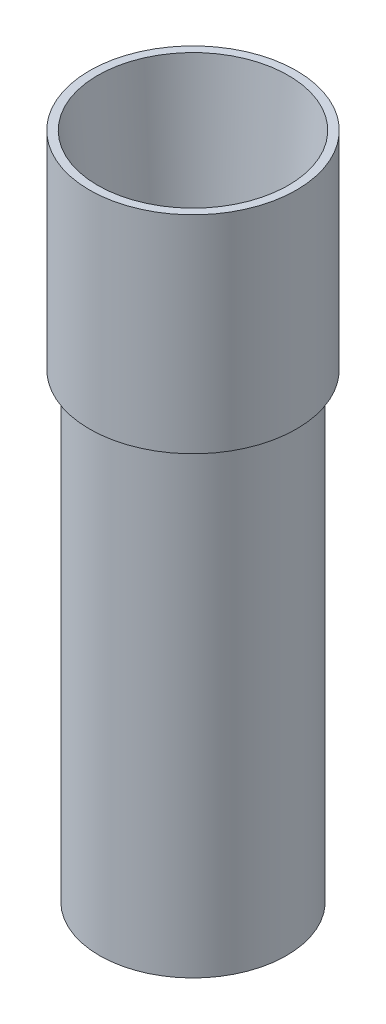
ISO-10303-21;
HEADER;
FILE_DESCRIPTION(('STEP AP214'),'2;1');
FILE_NAME('part.step','',(''),(''),'','','');
FILE_SCHEMA(('AUTOMOTIVE_DESIGN { 1 0 10303 214 1 1 1 1 }'));
ENDSEC;
DATA;
#1=APPLICATION_CONTEXT('core data for automotive mechanical design processes');
#2=APPLICATION_PROTOCOL_DEFINITION('international standard','automotive_design',2000,#1);
#3=PRODUCT_CONTEXT('',#1,'mechanical');
#4=PRODUCT('Part','Part','',(#3));
#5=PRODUCT_RELATED_PRODUCT_CATEGORY('part','',(#4));
#6=PRODUCT_DEFINITION_FORMATION('','',#4);
#7=PRODUCT_DEFINITION_CONTEXT('part definition',#1,'design');
#8=PRODUCT_DEFINITION('design','',#6,#7);
#9=PRODUCT_DEFINITION_SHAPE('','',#8);
#10=(LENGTH_UNIT() NAMED_UNIT(*) SI_UNIT(.MILLI.,.METRE.));
#11=(NAMED_UNIT(*) PLANE_ANGLE_UNIT() SI_UNIT($,.RADIAN.));
#12=(NAMED_UNIT(*) SI_UNIT($,.STERADIAN.) SOLID_ANGLE_UNIT());
#13=UNCERTAINTY_MEASURE_WITH_UNIT(LENGTH_MEASURE(1.E-05),#10,'distance_accuracy_value','');
#14=(GEOMETRIC_REPRESENTATION_CONTEXT(3) GLOBAL_UNCERTAINTY_ASSIGNED_CONTEXT((#13)) GLOBAL_UNIT_ASSIGNED_CONTEXT((#10,
#11,#12)) REPRESENTATION_CONTEXT('',''));
#15=CARTESIAN_POINT('',(0.,0.,0.));
#16=DIRECTION('',(0.,0.,1.));
#17=DIRECTION('',(1.,0.,0.));
#18=AXIS2_PLACEMENT_3D('',#15,#16,#17);
#19=CARTESIAN_POINT('',(0.,-82.,0.));
#20=DIRECTION('',(0.,1.,0.));
#21=DIRECTION('',(0.,0.,1.));
#22=AXIS2_PLACEMENT_3D('',#19,#20,#21);
#23=CYLINDRICAL_SURFACE('',#22,12.7);
#24=CARTESIAN_POINT('',(0.,-25.4067885119402,0.));
#25=DIRECTION('',(0.,1.,0.));
#26=DIRECTION('',(0.,0.,1.));
#27=AXIS2_PLACEMENT_3D('',#24,#25,#26);
#28=CIRCLE('',#27,12.7);
#29=CARTESIAN_POINT('',(0.,-25.4067885119402,12.7));
#30=VERTEX_POINT('',#29);
#31=EDGE_CURVE('E35',#30,#30,#28,.F.);
#32=ORIENTED_EDGE('',*,*,#31,.F.);
#33=EDGE_LOOP('',(#32));
#34=FACE_BOUND('',#33,.T.);
#35=CARTESIAN_POINT('',(0.,0.,0.));
#36=DIRECTION('',(0.,1.,0.));
#37=DIRECTION('',(0.,0.,1.));
#38=AXIS2_PLACEMENT_3D('',#35,#36,#37);
#39=CIRCLE('',#38,12.7);
#40=CARTESIAN_POINT('',(0.,0.,12.7));
#41=VERTEX_POINT('',#40);
#42=EDGE_CURVE('E11',#41,#41,#39,.T.);
#43=ORIENTED_EDGE('',*,*,#42,.F.);
#44=EDGE_LOOP('',(#43));
#45=FACE_BOUND('',#44,.T.);
#46=ADVANCED_FACE('F32',(#34,#45),#23,.T.);
#47=CARTESIAN_POINT('',(0.,0.,0.));
#48=DIRECTION('',(0.,1.,0.));
#49=DIRECTION('',(0.,0.,1.));
#50=AXIS2_PLACEMENT_3D('',#47,#48,#49);
#51=PLANE('',#50);
#52=CARTESIAN_POINT('',(0.,0.,0.));
#53=DIRECTION('',(0.,1.,0.));
#54=DIRECTION('',(0.,0.,1.));
#55=AXIS2_PLACEMENT_3D('',#52,#53,#54);
#56=CIRCLE('',#55,11.7);
#57=CARTESIAN_POINT('',(0.,0.,11.7));
#58=VERTEX_POINT('',#57);
#59=EDGE_CURVE('E39',#58,#58,#56,.T.);
#60=ORIENTED_EDGE('',*,*,#59,.F.);
#61=EDGE_LOOP('',(#60));
#62=FACE_BOUND('',#61,.T.);
#63=ORIENTED_EDGE('',*,*,#42,.T.);
#64=EDGE_LOOP('',(#63));
#65=FACE_BOUND('',#64,.T.);
#66=ADVANCED_FACE('F66',(#62,#65),#51,.T.);
#67=CARTESIAN_POINT('',(0.,0.,0.));
#68=DIRECTION('',(0.,1.,0.));
#69=DIRECTION('',(0.,0.,1.));
#70=AXIS2_PLACEMENT_3D('',#67,#68,#69);
#71=CONICAL_SURFACE('',#70,11.7,0.0872664625997167);
#72=CARTESIAN_POINT('',(0.,-25.4,0.));
#73=DIRECTION('',(0.,1.,0.));
#74=DIRECTION('',(0.,0.,1.));
#75=AXIS2_PLACEMENT_3D('',#72,#73,#74);
#76=CIRCLE('',#75,9.47778794644152);
#77=CARTESIAN_POINT('',(0.,-25.4,9.47778794644152));
#78=VERTEX_POINT('',#77);
#79=EDGE_CURVE('E46',#78,#78,#76,.T.);
#80=ORIENTED_EDGE('',*,*,#79,.F.);
#81=EDGE_LOOP('',(#80));
#82=FACE_BOUND('',#81,.T.);
#83=ORIENTED_EDGE('',*,*,#59,.T.);
#84=EDGE_LOOP('',(#83));
#85=FACE_BOUND('',#84,.T.);
#86=ADVANCED_FACE('F70',(#82,#85),#71,.F.);
#87=CARTESIAN_POINT('',(0.,-78.78,0.));
#88=DIRECTION('',(0.,1.,0.));
#89=DIRECTION('',(0.,0.,1.));
#90=AXIS2_PLACEMENT_3D('',#87,#88,#89);
#91=CYLINDRICAL_SURFACE('',#90,9.47778794644152);
#92=CARTESIAN_POINT('',(0.,-78.78,0.));
#93=DIRECTION('',(0.,1.,0.));
#94=DIRECTION('',(0.,0.,1.));
#95=AXIS2_PLACEMENT_3D('',#92,#93,#94);
#96=CIRCLE('',#95,9.47778794644152);
#97=CARTESIAN_POINT('',(0.,-78.78,9.47778794644152));
#98=VERTEX_POINT('',#97);
#99=EDGE_CURVE('E43',#98,#98,#96,.T.);
#100=CARTESIAN_POINT('',(0.,-78.78,9.47778794644152));
#101=CARTESIAN_POINT('',(0.,-78.2239583333333,9.47778794644152));
#102=CARTESIAN_POINT('',(0.,-77.6679166666667,9.47778794644152));
#103=CARTESIAN_POINT('',(0.,-76.5558333333333,9.47778794644152));
#104=CARTESIAN_POINT('',(0.,-75.9997916666667,9.47778794644152));
#105=CARTESIAN_POINT('',(0.,-74.8877083333334,9.47778794644152));
#106=CARTESIAN_POINT('',(0.,-74.3316666666667,9.47778794644152));
#107=CARTESIAN_POINT('',(0.,-73.2195833333333,9.47778794644152));
#108=CARTESIAN_POINT('',(0.,-72.6635416666667,9.47778794644152));
#109=CARTESIAN_POINT('',(0.,-71.5514583333333,9.47778794644152));
#110=CARTESIAN_POINT('',(0.,-70.9954166666667,9.47778794644152));
#111=CARTESIAN_POINT('',(0.,-69.8833333333333,9.47778794644152));
#112=CARTESIAN_POINT('',(0.,-69.3272916666667,9.47778794644152));
#113=CARTESIAN_POINT('',(0.,-68.2152083333334,9.47778794644152));
#114=CARTESIAN_POINT('',(0.,-67.6591666666667,9.47778794644152));
#115=CARTESIAN_POINT('',(0.,-66.5470833333333,9.47778794644152));
#116=CARTESIAN_POINT('',(0.,-65.9910416666667,9.47778794644152));
#117=CARTESIAN_POINT('',(0.,-64.8789583333333,9.47778794644152));
#118=CARTESIAN_POINT('',(0.,-64.3229166666667,9.47778794644152));
#119=CARTESIAN_POINT('',(0.,-63.2108333333333,9.47778794644152));
#120=CARTESIAN_POINT('',(0.,-62.6547916666667,9.47778794644152));
#121=CARTESIAN_POINT('',(0.,-61.5427083333333,9.47778794644152));
#122=CARTESIAN_POINT('',(0.,-60.9866666666667,9.47778794644152));
#123=CARTESIAN_POINT('',(0.,-59.8745833333333,9.47778794644152));
#124=CARTESIAN_POINT('',(0.,-59.3185416666667,9.47778794644152));
#125=CARTESIAN_POINT('',(0.,-58.2064583333333,9.47778794644152));
#126=CARTESIAN_POINT('',(0.,-57.6504166666667,9.47778794644152));
#127=CARTESIAN_POINT('',(0.,-56.5383333333333,9.47778794644152));
#128=CARTESIAN_POINT('',(0.,-55.9822916666667,9.47778794644152));
#129=CARTESIAN_POINT('',(0.,-54.8702083333333,9.47778794644152));
#130=CARTESIAN_POINT('',(0.,-54.3141666666667,9.47778794644152));
#131=CARTESIAN_POINT('',(0.,-53.2020833333333,9.47778794644152));
#132=CARTESIAN_POINT('',(0.,-52.6460416666667,9.47778794644152));
#133=CARTESIAN_POINT('',(0.,-51.5339583333333,9.47778794644152));
#134=CARTESIAN_POINT('',(0.,-50.9779166666667,9.47778794644152));
#135=CARTESIAN_POINT('',(0.,-49.8658333333333,9.47778794644152));
#136=CARTESIAN_POINT('',(0.,-49.3097916666667,9.47778794644152));
#137=CARTESIAN_POINT('',(0.,-48.1977083333333,9.47778794644152));
#138=CARTESIAN_POINT('',(0.,-47.6416666666667,9.47778794644152));
#139=CARTESIAN_POINT('',(0.,-46.5295833333333,9.47778794644152));
#140=CARTESIAN_POINT('',(0.,-45.9735416666667,9.47778794644152));
#141=CARTESIAN_POINT('',(0.,-44.8614583333333,9.47778794644152));
#142=CARTESIAN_POINT('',(0.,-44.3054166666667,9.47778794644152));
#143=CARTESIAN_POINT('',(0.,-43.1933333333333,9.47778794644152));
#144=CARTESIAN_POINT('',(0.,-42.6372916666667,9.47778794644152));
#145=CARTESIAN_POINT('',(0.,-41.5252083333333,9.47778794644152));
#146=CARTESIAN_POINT('',(0.,-40.9691666666667,9.47778794644152));
#147=CARTESIAN_POINT('',(0.,-39.8570833333333,9.47778794644152));
#148=CARTESIAN_POINT('',(0.,-39.3010416666667,9.47778794644152));
#149=CARTESIAN_POINT('',(0.,-38.1889583333333,9.47778794644152));
#150=CARTESIAN_POINT('',(0.,-37.6329166666667,9.47778794644152));
#151=CARTESIAN_POINT('',(0.,-36.5208333333333,9.47778794644152));
#152=CARTESIAN_POINT('',(0.,-35.9647916666667,9.47778794644152));
#153=CARTESIAN_POINT('',(0.,-34.8527083333333,9.47778794644152));
#154=CARTESIAN_POINT('',(0.,-34.2966666666667,9.47778794644152));
#155=CARTESIAN_POINT('',(0.,-33.1845833333333,9.47778794644152));
#156=CARTESIAN_POINT('',(0.,-32.6285416666667,9.47778794644152));
#157=CARTESIAN_POINT('',(0.,-31.5164583333333,9.47778794644152));
#158=CARTESIAN_POINT('',(0.,-30.9604166666667,9.47778794644152));
#159=CARTESIAN_POINT('',(0.,-29.8483333333333,9.47778794644152));
#160=CARTESIAN_POINT('',(0.,-29.2922916666667,9.47778794644152));
#161=CARTESIAN_POINT('',(0.,-28.1802083333333,9.47778794644152));
#162=CARTESIAN_POINT('',(0.,-27.6241666666667,9.47778794644152));
#163=CARTESIAN_POINT('',(0.,-26.5120833333333,9.47778794644152));
#164=CARTESIAN_POINT('',(0.,-25.9560416666667,9.47778794644152));
#165=CARTESIAN_POINT('',(0.,-25.4,9.47778794644152));
#166=B_SPLINE_CURVE_WITH_KNOTS('',3,(#100,#101,#102,#103,#104,#105,#106,#107,#108,#109,#110,
#111,#112,#113,#114,#115,#116,#117,#118,#119,#120,#121,#122,#123,#124,#125,#126,#127,#128,#129,
#130,#131,#132,#133,#134,#135,#136,#137,#138,#139,#140,#141,#142,#143,#144,#145,#146,#147,#148,
#149,#150,#151,#152,#153,#154,#155,#156,#157,#158,#159,#160,#161,#162,#163,#164,#165),
.UNSPECIFIED.,.F.,.F.,(4,2,2,2,2,2,2,2,2,2,2,2,2,2,2,2,2,2,2,2,2,2,2,2,2,2,2,2,2,2,2,2,4),(0.,
1.66812499999999,3.33625,5.00437499999999,6.6725,8.34062499999999,10.00875,11.676875,13.345,
15.013125,16.68125,18.349375,20.0175,21.685625,23.35375,25.021875,26.69,28.358125,30.02625,
31.694375,33.3625,35.030625,36.69875,38.366875,40.035,41.703125,43.37125,45.039375,46.7075,
48.375625,50.04375,51.711875,53.38),.UNSPECIFIED.);
#167=EDGE_CURVE('BSEAM75',#98,#78,#166,.T.);
#168=ORIENTED_EDGE('',*,*,#99,.F.);
#169=ORIENTED_EDGE('',*,*,#79,.T.);
#170=ORIENTED_EDGE('',*,*,#167,.T.);
#171=ORIENTED_EDGE('',*,*,#167,.F.);
#172=EDGE_LOOP('',(#168,#170,#169,#171));
#173=FACE_BOUND('',#172,.T.);
#174=ADVANCED_FACE('F75',(#173),#91,.F.);
#175=CARTESIAN_POINT('',(0.,-78.78,0.));
#176=DIRECTION('',(0.,1.,0.));
#177=DIRECTION('',(0.,0.,1.));
#178=AXIS2_PLACEMENT_3D('',#175,#176,#177);
#179=PLANE('',#178);
#180=ORIENTED_EDGE('',*,*,#99,.T.);
#181=EDGE_LOOP('',(#180));
#182=FACE_BOUND('',#181,.T.);
#183=ADVANCED_FACE('F87',(#182),#179,.T.);
#184=CARTESIAN_POINT('',(0.,-25.4067885119402,0.));
#185=DIRECTION('',(0.,1.,0.));
#186=DIRECTION('',(0.,0.,1.));
#187=AXIS2_PLACEMENT_3D('',#184,#185,#186);
#188=PLANE('',#187);
#189=ORIENTED_EDGE('',*,*,#31,.T.);
#190=EDGE_LOOP('',(#189));
#191=FACE_BOUND('',#190,.T.);
#192=CARTESIAN_POINT('',(0.,-25.4067885119402,0.));
#193=DIRECTION('',(0.,1.,0.));
#194=DIRECTION('',(0.,0.,1.));
#195=AXIS2_PLACEMENT_3D('',#192,#193,#194);
#196=CIRCLE('',#195,11.4777879464415);
#197=CARTESIAN_POINT('',(0.,-25.4067885119402,11.4777879464415));
#198=VERTEX_POINT('',#197);
#199=EDGE_CURVE('E51',#198,#198,#196,.T.);
#200=ORIENTED_EDGE('',*,*,#199,.T.);
#201=EDGE_LOOP('',(#200));
#202=FACE_BOUND('',#201,.T.);
#203=ADVANCED_FACE('F61',(#191,#202),#188,.F.);
#204=CARTESIAN_POINT('',(0.,-82.,0.));
#205=DIRECTION('',(0.,1.,0.));
#206=DIRECTION('',(0.,0.,1.));
#207=AXIS2_PLACEMENT_3D('',#204,#205,#206);
#208=CYLINDRICAL_SURFACE('',#207,11.4777879464415);
#209=CARTESIAN_POINT('',(0.,-82.,0.));
#210=DIRECTION('',(0.,1.,0.));
#211=DIRECTION('',(0.,0.,1.));
#212=AXIS2_PLACEMENT_3D('',#209,#210,#211);
#213=CIRCLE('',#212,11.4777879464415);
#214=CARTESIAN_POINT('',(0.,-82.,11.4777879464415));
#215=VERTEX_POINT('',#214);
#216=EDGE_CURVE('E54',#215,#215,#213,.T.);
#217=ORIENTED_EDGE('',*,*,#216,.T.);
#218=EDGE_LOOP('',(#217));
#219=FACE_BOUND('',#218,.T.);
#220=ORIENTED_EDGE('',*,*,#199,.F.);
#221=EDGE_LOOP('',(#220));
#222=FACE_BOUND('',#221,.T.);
#223=ADVANCED_FACE('F82',(#219,#222),#208,.T.);
#224=CARTESIAN_POINT('',(0.,-82.,0.));
#225=DIRECTION('',(0.,1.,0.));
#226=DIRECTION('',(0.,0.,1.));
#227=AXIS2_PLACEMENT_3D('',#224,#225,#226);
#228=PLANE('',#227);
#229=ORIENTED_EDGE('',*,*,#216,.F.);
#230=EDGE_LOOP('',(#229));
#231=FACE_BOUND('',#230,.T.);
#232=ADVANCED_FACE('F80',(#231),#228,.F.);
#233=CLOSED_SHELL('',(#46,#66,#86,#174,#183,#203,#223,#232));
#234=MANIFOLD_SOLID_BREP('B2',#233);
#235=ADVANCED_BREP_SHAPE_REPRESENTATION('',(#18,#234),#14);
#236=SHAPE_DEFINITION_REPRESENTATION(#9,#235);
ENDSEC;
END-ISO-10303-21;
